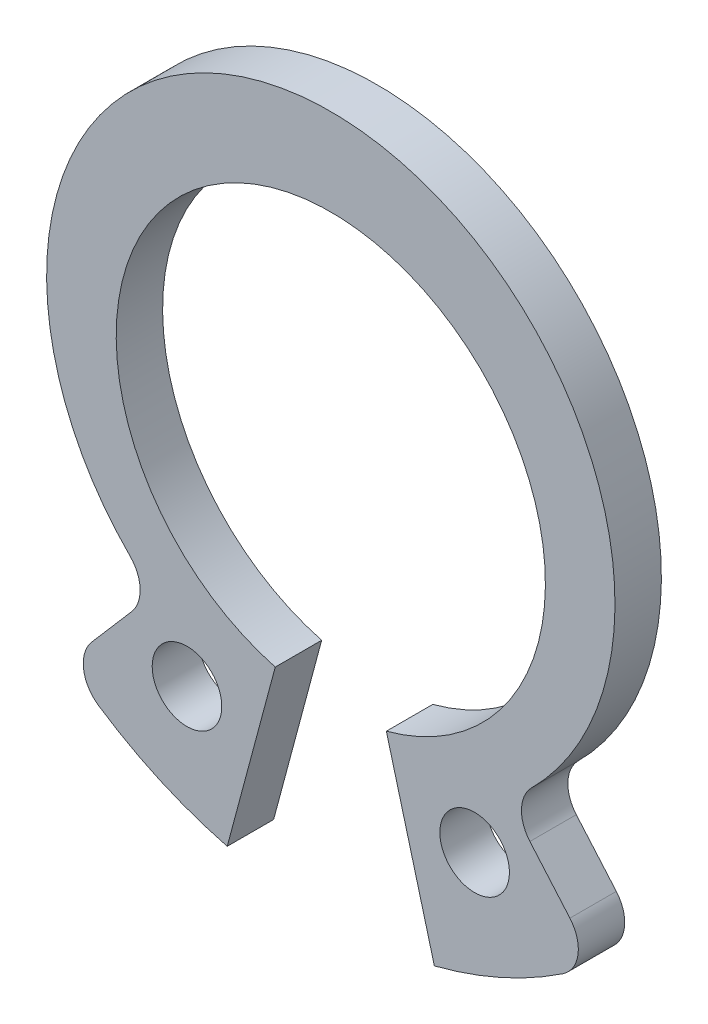
ISO-10303-21;
HEADER;
FILE_DESCRIPTION(('STEP AP214'),'2;1');
FILE_NAME('part.step','',(''),(''),'','','');
FILE_SCHEMA(('AUTOMOTIVE_DESIGN { 1 0 10303 214 1 1 1 1 }'));
ENDSEC;
DATA;
#1=APPLICATION_CONTEXT('core data for automotive mechanical design processes');
#2=APPLICATION_PROTOCOL_DEFINITION('international standard','automotive_design',2000,#1);
#3=PRODUCT_CONTEXT('',#1,'mechanical');
#4=PRODUCT('Part','Part','',(#3));
#5=PRODUCT_RELATED_PRODUCT_CATEGORY('part','',(#4));
#6=PRODUCT_DEFINITION_FORMATION('','',#4);
#7=PRODUCT_DEFINITION_CONTEXT('part definition',#1,'design');
#8=PRODUCT_DEFINITION('design','',#6,#7);
#9=PRODUCT_DEFINITION_SHAPE('','',#8);
#10=(LENGTH_UNIT() NAMED_UNIT(*) SI_UNIT(.MILLI.,.METRE.));
#11=(NAMED_UNIT(*) PLANE_ANGLE_UNIT() SI_UNIT($,.RADIAN.));
#12=(NAMED_UNIT(*) SI_UNIT($,.STERADIAN.) SOLID_ANGLE_UNIT());
#13=UNCERTAINTY_MEASURE_WITH_UNIT(LENGTH_MEASURE(1.E-05),#10,'distance_accuracy_value','');
#14=(GEOMETRIC_REPRESENTATION_CONTEXT(3) GLOBAL_UNCERTAINTY_ASSIGNED_CONTEXT((#13)) GLOBAL_UNIT_ASSIGNED_CONTEXT((#10,
#11,#12)) REPRESENTATION_CONTEXT('',''));
#15=CARTESIAN_POINT('',(0.,0.,0.));
#16=DIRECTION('',(0.,0.,1.));
#17=DIRECTION('',(1.,0.,0.));
#18=AXIS2_PLACEMENT_3D('',#15,#16,#17);
#19=CARTESIAN_POINT('',(-3.88705054500589,-3.59112298193843,0.8));
#20=DIRECTION('',(0.,0.,-1.));
#21=DIRECTION('',(-1.,0.,0.));
#22=AXIS2_PLACEMENT_3D('',#19,#20,#21);
#23=PLANE('',#22);
#24=CARTESIAN_POINT('',(2.4797895302576,-4.62373948499954,0.8));
#25=DIRECTION('',(0.,0.,1.));
#26=DIRECTION('',(1.,0.,0.));
#27=AXIS2_PLACEMENT_3D('',#24,#25,#26);
#28=CIRCLE('',#27,0.6);
#29=CARTESIAN_POINT('',(3.0797895302576,-4.62373948499954,0.8));
#30=VERTEX_POINT('',#29);
#31=EDGE_CURVE('E139',#30,#30,#28,.T.);
#32=ORIENTED_EDGE('',*,*,#31,.F.);
#33=EDGE_LOOP('',(#32));
#34=FACE_BOUND('',#33,.T.);
#35=CARTESIAN_POINT('',(-3.88705054500589,-3.59112298193843,0.8));
#36=DIRECTION('',(0.,0.,-1.));
#37=DIRECTION('',(-1.,0.,0.));
#38=AXIS2_PLACEMENT_3D('',#35,#36,#37);
#39=CIRCLE('',#38,0.600000000000001);
#40=CARTESIAN_POINT('',(-3.46300866736889,-3.16663683845423,0.8));
#41=VERTEX_POINT('',#40);
#42=CARTESIAN_POINT('',(-3.43255273753933,-3.98282662374954,0.8));
#43=VERTEX_POINT('',#42);
#44=EDGE_CURVE('E165',#41,#43,#39,.T.);
#45=ORIENTED_EDGE('',*,*,#44,.T.);
#46=DIRECTION('',(-0.652839403018525,-0.757496345777599,0.));
#47=VECTOR('',#46,1.);
#48=CARTESIAN_POINT('',(-3.43255273753933,-3.98282662374954,0.8));
#49=LINE('',#48,#47);
#50=CARTESIAN_POINT('',(-4.12249600229278,-4.78337496600359,0.8));
#51=VERTEX_POINT('',#50);
#52=EDGE_CURVE('E134',#43,#51,#49,.T.);
#53=ORIENTED_EDGE('',*,*,#52,.T.);
#54=CARTESIAN_POINT('',(-3.66799819482622,-5.1750786078147,0.8));
#55=DIRECTION('',(0.,0.,1.));
#56=DIRECTION('',(-1.,0.,0.));
#57=AXIS2_PLACEMENT_3D('',#54,#55,#56);
#58=CIRCLE('',#57,0.600000000000001);
#59=CARTESIAN_POINT('',(-4.00194859363588,-5.67355341272953,0.8));
#60=VERTEX_POINT('',#59);
#61=EDGE_CURVE('E168',#51,#60,#58,.T.);
#62=ORIENTED_EDGE('',*,*,#61,.T.);
#63=CARTESIAN_POINT('',(0.,0.3,0.8));
#64=DIRECTION('',(0.,0.,1.));
#65=DIRECTION('',(1.,0.,0.));
#66=AXIS2_PLACEMENT_3D('',#63,#64,#65);
#67=CIRCLE('',#66,7.19019700153179);
#68=CARTESIAN_POINT('',(-1.7858514112074,-6.66488820139457,0.8));
#69=VERTEX_POINT('',#68);
#70=EDGE_CURVE('E170',#60,#69,#67,.T.);
#71=ORIENTED_EDGE('',*,*,#70,.T.);
#72=DIRECTION('',(0.258819045102521,0.965925826289068,0.));
#73=VECTOR('',#72,1.);
#74=CARTESIAN_POINT('',(-0.957630466879329,-3.57392555726955,0.8));
#75=LINE('',#74,#73);
#76=CARTESIAN_POINT('',(-0.957630466879326,-3.57392555726955,0.8));
#77=VERTEX_POINT('',#76);
#78=EDGE_CURVE('E172',#69,#77,#75,.T.);
#79=ORIENTED_EDGE('',*,*,#78,.T.);
#80=CARTESIAN_POINT('',(0.,0.,0.8));
#81=DIRECTION('',(0.,0.,-1.));
#82=DIRECTION('',(1.,0.,0.));
#83=AXIS2_PLACEMENT_3D('',#80,#81,#82);
#84=CIRCLE('',#83,3.7);
#85=CARTESIAN_POINT('',(0.957630466879329,-3.57392555726955,0.8));
#86=VERTEX_POINT('',#85);
#87=EDGE_CURVE('E174',#77,#86,#84,.T.);
#88=ORIENTED_EDGE('',*,*,#87,.T.);
#89=DIRECTION('',(0.258819045102521,-0.965925826289068,0.));
#90=VECTOR('',#89,1.);
#91=CARTESIAN_POINT('',(0.957630466879329,-3.57392555726955,0.8));
#92=LINE('',#91,#90);
#93=CARTESIAN_POINT('',(1.7858514112074,-6.66488820139457,0.8));
#94=VERTEX_POINT('',#93);
#95=EDGE_CURVE('E176',#86,#94,#92,.T.);
#96=ORIENTED_EDGE('',*,*,#95,.T.);
#97=CARTESIAN_POINT('',(0.,0.3,0.8));
#98=DIRECTION('',(0.,0.,1.));
#99=DIRECTION('',(1.,0.,0.));
#100=AXIS2_PLACEMENT_3D('',#97,#98,#99);
#101=CIRCLE('',#100,7.19019700153179);
#102=CARTESIAN_POINT('',(4.00194859363587,-5.67355341272953,0.8));
#103=VERTEX_POINT('',#102);
#104=EDGE_CURVE('E178',#94,#103,#101,.T.);
#105=ORIENTED_EDGE('',*,*,#104,.T.);
#106=CARTESIAN_POINT('',(3.66799819482622,-5.1750786078147,0.8));
#107=DIRECTION('',(0.,0.,1.));
#108=DIRECTION('',(1.,0.,0.));
#109=AXIS2_PLACEMENT_3D('',#106,#107,#108);
#110=CIRCLE('',#109,0.600000000000001);
#111=CARTESIAN_POINT('',(4.12249600229278,-4.78337496600359,0.8));
#112=VERTEX_POINT('',#111);
#113=EDGE_CURVE('E180',#103,#112,#110,.T.);
#114=ORIENTED_EDGE('',*,*,#113,.T.);
#115=DIRECTION('',(-0.652839403018525,0.757496345777599,0.));
#116=VECTOR('',#115,1.);
#117=CARTESIAN_POINT('',(3.43255273753933,-3.98282662374954,0.8));
#118=LINE('',#117,#116);
#119=CARTESIAN_POINT('',(3.43255273753933,-3.98282662374954,0.8));
#120=VERTEX_POINT('',#119);
#121=EDGE_CURVE('E182',#112,#120,#118,.T.);
#122=ORIENTED_EDGE('',*,*,#121,.T.);
#123=CARTESIAN_POINT('',(3.88705054500589,-3.59112298193843,0.8));
#124=DIRECTION('',(0.,0.,-1.));
#125=DIRECTION('',(1.,0.,0.));
#126=AXIS2_PLACEMENT_3D('',#123,#124,#125);
#127=CIRCLE('',#126,0.600000000000001);
#128=CARTESIAN_POINT('',(3.46300866736888,-3.16663683845424,0.8));
#129=VERTEX_POINT('',#128);
#130=EDGE_CURVE('E51',#120,#129,#127,.T.);
#131=ORIENTED_EDGE('',*,*,#130,.T.);
#132=CARTESIAN_POINT('',(0.,0.3,0.8));
#133=DIRECTION('',(0.,0.,1.));
#134=DIRECTION('',(1.,0.,0.));
#135=AXIS2_PLACEMENT_3D('',#132,#133,#134);
#136=CIRCLE('',#135,4.9);
#137=EDGE_CURVE('E46',#129,#41,#136,.T.);
#138=ORIENTED_EDGE('',*,*,#137,.T.);
#139=EDGE_LOOP('',(#45,#53,#62,#71,#79,#88,#96,#105,#114,#122,#131,#138));
#140=FACE_BOUND('',#139,.T.);
#141=CARTESIAN_POINT('',(-2.4797895302576,-4.62373948499954,0.8));
#142=DIRECTION('',(0.,0.,1.));
#143=DIRECTION('',(-1.,0.,0.));
#144=AXIS2_PLACEMENT_3D('',#141,#142,#143);
#145=CIRCLE('',#144,0.6);
#146=CARTESIAN_POINT('',(-3.0797895302576,-4.62373948499954,0.8));
#147=VERTEX_POINT('',#146);
#148=EDGE_CURVE('E285',#147,#147,#145,.T.);
#149=ORIENTED_EDGE('',*,*,#148,.F.);
#150=EDGE_LOOP('',(#149));
#151=FACE_BOUND('',#150,.T.);
#152=ADVANCED_FACE('F31',(#34,#140,#151),#23,.F.);
#153=CARTESIAN_POINT('',(-3.88705054500589,-3.59112298193843,0.));
#154=DIRECTION('',(0.,0.,-1.));
#155=DIRECTION('',(-1.,0.,0.));
#156=AXIS2_PLACEMENT_3D('',#153,#154,#155);
#157=PLANE('',#156);
#158=CARTESIAN_POINT('',(2.4797895302576,-4.62373948499954,0.));
#159=DIRECTION('',(0.,0.,1.));
#160=DIRECTION('',(1.,0.,0.));
#161=AXIS2_PLACEMENT_3D('',#158,#159,#160);
#162=CIRCLE('',#161,0.6);
#163=CARTESIAN_POINT('',(3.0797895302576,-4.62373948499954,0.));
#164=VERTEX_POINT('',#163);
#165=EDGE_CURVE('E142',#164,#164,#162,.T.);
#166=ORIENTED_EDGE('',*,*,#165,.T.);
#167=EDGE_LOOP('',(#166));
#168=FACE_BOUND('',#167,.T.);
#169=CARTESIAN_POINT('',(-3.88705054500589,-3.59112298193843,0.));
#170=DIRECTION('',(0.,0.,-1.));
#171=DIRECTION('',(-1.,0.,0.));
#172=AXIS2_PLACEMENT_3D('',#169,#170,#171);
#173=CIRCLE('',#172,0.600000000000001);
#174=CARTESIAN_POINT('',(-3.46300866736889,-3.16663683845423,0.));
#175=VERTEX_POINT('',#174);
#176=CARTESIAN_POINT('',(-3.43255273753933,-3.98282662374954,0.));
#177=VERTEX_POINT('',#176);
#178=EDGE_CURVE('E125',#175,#177,#173,.T.);
#179=ORIENTED_EDGE('',*,*,#178,.F.);
#180=CARTESIAN_POINT('',(0.,0.3,0.));
#181=DIRECTION('',(0.,0.,1.));
#182=DIRECTION('',(1.,0.,0.));
#183=AXIS2_PLACEMENT_3D('',#180,#181,#182);
#184=CIRCLE('',#183,4.9);
#185=CARTESIAN_POINT('',(3.46300866736888,-3.16663683845424,0.));
#186=VERTEX_POINT('',#185);
#187=EDGE_CURVE('E163',#186,#175,#184,.T.);
#188=ORIENTED_EDGE('',*,*,#187,.F.);
#189=CARTESIAN_POINT('',(3.88705054500589,-3.59112298193843,0.));
#190=DIRECTION('',(0.,0.,-1.));
#191=DIRECTION('',(1.,0.,0.));
#192=AXIS2_PLACEMENT_3D('',#189,#190,#191);
#193=CIRCLE('',#192,0.600000000000001);
#194=CARTESIAN_POINT('',(3.43255273753933,-3.98282662374954,0.));
#195=VERTEX_POINT('',#194);
#196=EDGE_CURVE('E161',#195,#186,#193,.T.);
#197=ORIENTED_EDGE('',*,*,#196,.F.);
#198=DIRECTION('',(-0.652839403018525,0.757496345777599,0.));
#199=VECTOR('',#198,1.);
#200=CARTESIAN_POINT('',(3.43255273753933,-3.98282662374954,0.));
#201=LINE('',#200,#199);
#202=CARTESIAN_POINT('',(4.12249600229278,-4.78337496600359,0.));
#203=VERTEX_POINT('',#202);
#204=EDGE_CURVE('E159',#203,#195,#201,.T.);
#205=ORIENTED_EDGE('',*,*,#204,.F.);
#206=CARTESIAN_POINT('',(3.66799819482622,-5.1750786078147,0.));
#207=DIRECTION('',(0.,0.,1.));
#208=DIRECTION('',(1.,0.,0.));
#209=AXIS2_PLACEMENT_3D('',#206,#207,#208);
#210=CIRCLE('',#209,0.600000000000001);
#211=CARTESIAN_POINT('',(4.00194859363587,-5.67355341272953,0.));
#212=VERTEX_POINT('',#211);
#213=EDGE_CURVE('E157',#212,#203,#210,.T.);
#214=ORIENTED_EDGE('',*,*,#213,.F.);
#215=CARTESIAN_POINT('',(0.,0.3,0.));
#216=DIRECTION('',(0.,0.,1.));
#217=DIRECTION('',(1.,0.,0.));
#218=AXIS2_PLACEMENT_3D('',#215,#216,#217);
#219=CIRCLE('',#218,7.19019700153179);
#220=CARTESIAN_POINT('',(1.7858514112074,-6.66488820139457,0.));
#221=VERTEX_POINT('',#220);
#222=EDGE_CURVE('E155',#221,#212,#219,.T.);
#223=ORIENTED_EDGE('',*,*,#222,.F.);
#224=DIRECTION('',(0.258819045102521,-0.965925826289068,0.));
#225=VECTOR('',#224,1.);
#226=CARTESIAN_POINT('',(0.957630466879329,-3.57392555726955,0.));
#227=LINE('',#226,#225);
#228=CARTESIAN_POINT('',(0.957630466879329,-3.57392555726955,0.));
#229=VERTEX_POINT('',#228);
#230=EDGE_CURVE('E153',#229,#221,#227,.T.);
#231=ORIENTED_EDGE('',*,*,#230,.F.);
#232=CARTESIAN_POINT('',(0.,0.,0.));
#233=DIRECTION('',(0.,0.,-1.));
#234=DIRECTION('',(1.,0.,0.));
#235=AXIS2_PLACEMENT_3D('',#232,#233,#234);
#236=CIRCLE('',#235,3.7);
#237=CARTESIAN_POINT('',(-0.957630466879326,-3.57392555726955,0.));
#238=VERTEX_POINT('',#237);
#239=EDGE_CURVE('E151',#238,#229,#236,.T.);
#240=ORIENTED_EDGE('',*,*,#239,.F.);
#241=DIRECTION('',(0.258819045102521,0.965925826289068,0.));
#242=VECTOR('',#241,1.);
#243=CARTESIAN_POINT('',(-0.957630466879329,-3.57392555726955,0.));
#244=LINE('',#243,#242);
#245=CARTESIAN_POINT('',(-1.7858514112074,-6.66488820139457,0.));
#246=VERTEX_POINT('',#245);
#247=EDGE_CURVE('E149',#246,#238,#244,.T.);
#248=ORIENTED_EDGE('',*,*,#247,.F.);
#249=CARTESIAN_POINT('',(0.,0.3,0.));
#250=DIRECTION('',(0.,0.,1.));
#251=DIRECTION('',(1.,0.,0.));
#252=AXIS2_PLACEMENT_3D('',#249,#250,#251);
#253=CIRCLE('',#252,7.19019700153179);
#254=CARTESIAN_POINT('',(-4.00194859363588,-5.67355341272953,0.));
#255=VERTEX_POINT('',#254);
#256=EDGE_CURVE('E147',#255,#246,#253,.T.);
#257=ORIENTED_EDGE('',*,*,#256,.F.);
#258=CARTESIAN_POINT('',(-3.66799819482622,-5.1750786078147,0.));
#259=DIRECTION('',(0.,0.,1.));
#260=DIRECTION('',(-1.,0.,0.));
#261=AXIS2_PLACEMENT_3D('',#258,#259,#260);
#262=CIRCLE('',#261,0.600000000000001);
#263=CARTESIAN_POINT('',(-4.12249600229278,-4.78337496600359,0.));
#264=VERTEX_POINT('',#263);
#265=EDGE_CURVE('E127',#264,#255,#262,.T.);
#266=ORIENTED_EDGE('',*,*,#265,.F.);
#267=DIRECTION('',(-0.652839403018525,-0.757496345777599,0.));
#268=VECTOR('',#267,1.);
#269=CARTESIAN_POINT('',(-3.43255273753933,-3.98282662374954,0.));
#270=LINE('',#269,#268);
#271=EDGE_CURVE('E120',#177,#264,#270,.T.);
#272=ORIENTED_EDGE('',*,*,#271,.F.);
#273=EDGE_LOOP('',(#179,#188,#197,#205,#214,#223,#231,#240,#248,#257,#266,#272));
#274=FACE_BOUND('',#273,.T.);
#275=CARTESIAN_POINT('',(-2.4797895302576,-4.62373948499954,0.));
#276=DIRECTION('',(0.,0.,1.));
#277=DIRECTION('',(-1.,0.,0.));
#278=AXIS2_PLACEMENT_3D('',#275,#276,#277);
#279=CIRCLE('',#278,0.6);
#280=CARTESIAN_POINT('',(-3.0797895302576,-4.62373948499954,0.));
#281=VERTEX_POINT('',#280);
#282=EDGE_CURVE('E288',#281,#281,#279,.T.);
#283=ORIENTED_EDGE('',*,*,#282,.T.);
#284=EDGE_LOOP('',(#283));
#285=FACE_BOUND('',#284,.T.);
#286=ADVANCED_FACE('F121',(#168,#274,#285),#157,.T.);
#287=CARTESIAN_POINT('',(-3.88705054500589,-3.59112298193843,0.8));
#288=DIRECTION('',(0.,0.,-1.));
#289=DIRECTION('',(-1.,0.,0.));
#290=AXIS2_PLACEMENT_3D('',#287,#288,#289);
#291=CYLINDRICAL_SURFACE('',#290,0.600000000000001);
#292=ORIENTED_EDGE('',*,*,#178,.T.);
#293=DIRECTION('',(0.,0.,-1.));
#294=VECTOR('',#293,1.);
#295=CARTESIAN_POINT('',(-3.43255273753933,-3.98282662374954,0.8));
#296=LINE('',#295,#294);
#297=EDGE_CURVE('E11',#43,#177,#296,.T.);
#298=ORIENTED_EDGE('',*,*,#297,.F.);
#299=ORIENTED_EDGE('',*,*,#44,.F.);
#300=DIRECTION('',(0.,0.,-1.));
#301=VECTOR('',#300,1.);
#302=CARTESIAN_POINT('',(-3.46300866736889,-3.16663683845423,0.8));
#303=LINE('',#302,#301);
#304=EDGE_CURVE('E138',#41,#175,#303,.T.);
#305=ORIENTED_EDGE('',*,*,#304,.T.);
#306=EDGE_LOOP('',(#292,#298,#299,#305));
#307=FACE_BOUND('',#306,.T.);
#308=ADVANCED_FACE('F33',(#307),#291,.F.);
#309=CARTESIAN_POINT('',(-3.43255273753933,-3.98282662374954,0.8));
#310=DIRECTION('',(0.757496345777599,-0.652839403018525,0.));
#311=DIRECTION('',(0.652839403018525,0.757496345777599,0.));
#312=AXIS2_PLACEMENT_3D('',#309,#310,#311);
#313=PLANE('',#312);
#314=ORIENTED_EDGE('',*,*,#271,.T.);
#315=DIRECTION('',(0.,0.,-1.));
#316=VECTOR('',#315,1.);
#317=CARTESIAN_POINT('',(-4.12249600229278,-4.78337496600359,0.8));
#318=LINE('',#317,#316);
#319=EDGE_CURVE('E39',#51,#264,#318,.T.);
#320=ORIENTED_EDGE('',*,*,#319,.F.);
#321=ORIENTED_EDGE('',*,*,#52,.F.);
#322=ORIENTED_EDGE('',*,*,#297,.T.);
#323=EDGE_LOOP('',(#314,#320,#321,#322));
#324=FACE_BOUND('',#323,.T.);
#325=ADVANCED_FACE('F133',(#324),#313,.F.);
#326=CARTESIAN_POINT('',(-3.66799819482622,-5.1750786078147,0.8));
#327=DIRECTION('',(0.,0.,-1.));
#328=DIRECTION('',(-1.,0.,0.));
#329=AXIS2_PLACEMENT_3D('',#326,#327,#328);
#330=CYLINDRICAL_SURFACE('',#329,0.600000000000001);
#331=ORIENTED_EDGE('',*,*,#265,.T.);
#332=DIRECTION('',(0.,0.,-1.));
#333=VECTOR('',#332,1.);
#334=CARTESIAN_POINT('',(-4.00194859363588,-5.67355341272953,0.8));
#335=LINE('',#334,#333);
#336=EDGE_CURVE('E211',#60,#255,#335,.T.);
#337=ORIENTED_EDGE('',*,*,#336,.F.);
#338=ORIENTED_EDGE('',*,*,#61,.F.);
#339=ORIENTED_EDGE('',*,*,#319,.T.);
#340=EDGE_LOOP('',(#331,#337,#338,#339));
#341=FACE_BOUND('',#340,.T.);
#342=ADVANCED_FACE('F215',(#341),#330,.T.);
#343=CARTESIAN_POINT('',(0.,0.3,0.8));
#344=DIRECTION('',(0.,0.,-1.));
#345=DIRECTION('',(-1.,0.,0.));
#346=AXIS2_PLACEMENT_3D('',#343,#344,#345);
#347=CYLINDRICAL_SURFACE('',#346,7.19019700153179);
#348=ORIENTED_EDGE('',*,*,#256,.T.);
#349=DIRECTION('',(0.,0.,-1.));
#350=VECTOR('',#349,1.);
#351=CARTESIAN_POINT('',(-1.7858514112074,-6.66488820139457,0.8));
#352=LINE('',#351,#350);
#353=EDGE_CURVE('E208',#69,#246,#352,.T.);
#354=ORIENTED_EDGE('',*,*,#353,.F.);
#355=ORIENTED_EDGE('',*,*,#70,.F.);
#356=ORIENTED_EDGE('',*,*,#336,.T.);
#357=EDGE_LOOP('',(#348,#354,#355,#356));
#358=FACE_BOUND('',#357,.T.);
#359=ADVANCED_FACE('F223',(#358),#347,.T.);
#360=CARTESIAN_POINT('',(-0.957630466879329,-3.57392555726955,0.8));
#361=DIRECTION('',(-0.965925826289068,0.258819045102521,0.));
#362=DIRECTION('',(-0.258819045102521,-0.965925826289068,0.));
#363=AXIS2_PLACEMENT_3D('',#360,#361,#362);
#364=PLANE('',#363);
#365=ORIENTED_EDGE('',*,*,#247,.T.);
#366=DIRECTION('',(0.,0.,-1.));
#367=VECTOR('',#366,1.);
#368=CARTESIAN_POINT('',(-0.957630466879326,-3.57392555726955,0.8));
#369=LINE('',#368,#367);
#370=EDGE_CURVE('E205',#77,#238,#369,.T.);
#371=ORIENTED_EDGE('',*,*,#370,.F.);
#372=ORIENTED_EDGE('',*,*,#78,.F.);
#373=ORIENTED_EDGE('',*,*,#353,.T.);
#374=EDGE_LOOP('',(#365,#371,#372,#373));
#375=FACE_BOUND('',#374,.T.);
#376=ADVANCED_FACE('F226',(#375),#364,.F.);
#377=CARTESIAN_POINT('',(0.,0.,0.8));
#378=DIRECTION('',(0.,0.,-1.));
#379=DIRECTION('',(-1.,0.,0.));
#380=AXIS2_PLACEMENT_3D('',#377,#378,#379);
#381=CYLINDRICAL_SURFACE('',#380,3.7);
#382=ORIENTED_EDGE('',*,*,#239,.T.);
#383=DIRECTION('',(0.,0.,-1.));
#384=VECTOR('',#383,1.);
#385=CARTESIAN_POINT('',(0.957630466879329,-3.57392555726955,0.8));
#386=LINE('',#385,#384);
#387=EDGE_CURVE('E202',#86,#229,#386,.T.);
#388=ORIENTED_EDGE('',*,*,#387,.F.);
#389=ORIENTED_EDGE('',*,*,#87,.F.);
#390=ORIENTED_EDGE('',*,*,#370,.T.);
#391=EDGE_LOOP('',(#382,#388,#389,#390));
#392=FACE_BOUND('',#391,.T.);
#393=ADVANCED_FACE('F231',(#392),#381,.F.);
#394=CARTESIAN_POINT('',(0.957630466879329,-3.57392555726955,0.8));
#395=DIRECTION('',(0.965925826289068,0.258819045102521,0.));
#396=DIRECTION('',(-0.258819045102521,0.965925826289068,0.));
#397=AXIS2_PLACEMENT_3D('',#394,#395,#396);
#398=PLANE('',#397);
#399=ORIENTED_EDGE('',*,*,#230,.T.);
#400=DIRECTION('',(0.,0.,-1.));
#401=VECTOR('',#400,1.);
#402=CARTESIAN_POINT('',(1.7858514112074,-6.66488820139457,0.8));
#403=LINE('',#402,#401);
#404=EDGE_CURVE('E199',#94,#221,#403,.T.);
#405=ORIENTED_EDGE('',*,*,#404,.F.);
#406=ORIENTED_EDGE('',*,*,#95,.F.);
#407=ORIENTED_EDGE('',*,*,#387,.T.);
#408=EDGE_LOOP('',(#399,#405,#406,#407));
#409=FACE_BOUND('',#408,.T.);
#410=ADVANCED_FACE('F237',(#409),#398,.F.);
#411=CARTESIAN_POINT('',(0.,0.3,0.8));
#412=DIRECTION('',(0.,0.,-1.));
#413=DIRECTION('',(-1.,0.,0.));
#414=AXIS2_PLACEMENT_3D('',#411,#412,#413);
#415=CYLINDRICAL_SURFACE('',#414,7.19019700153179);
#416=ORIENTED_EDGE('',*,*,#222,.T.);
#417=DIRECTION('',(0.,0.,-1.));
#418=VECTOR('',#417,1.);
#419=CARTESIAN_POINT('',(4.00194859363587,-5.67355341272953,0.8));
#420=LINE('',#419,#418);
#421=EDGE_CURVE('E196',#103,#212,#420,.T.);
#422=ORIENTED_EDGE('',*,*,#421,.F.);
#423=ORIENTED_EDGE('',*,*,#104,.F.);
#424=ORIENTED_EDGE('',*,*,#404,.T.);
#425=EDGE_LOOP('',(#416,#422,#423,#424));
#426=FACE_BOUND('',#425,.T.);
#427=ADVANCED_FACE('F241',(#426),#415,.T.);
#428=CARTESIAN_POINT('',(3.66799819482622,-5.1750786078147,0.8));
#429=DIRECTION('',(0.,0.,-1.));
#430=DIRECTION('',(-1.,0.,0.));
#431=AXIS2_PLACEMENT_3D('',#428,#429,#430);
#432=CYLINDRICAL_SURFACE('',#431,0.600000000000001);
#433=ORIENTED_EDGE('',*,*,#213,.T.);
#434=DIRECTION('',(0.,0.,-1.));
#435=VECTOR('',#434,1.);
#436=CARTESIAN_POINT('',(4.12249600229278,-4.78337496600359,0.8));
#437=LINE('',#436,#435);
#438=EDGE_CURVE('E193',#112,#203,#437,.T.);
#439=ORIENTED_EDGE('',*,*,#438,.F.);
#440=ORIENTED_EDGE('',*,*,#113,.F.);
#441=ORIENTED_EDGE('',*,*,#421,.T.);
#442=EDGE_LOOP('',(#433,#439,#440,#441));
#443=FACE_BOUND('',#442,.T.);
#444=ADVANCED_FACE('F246',(#443),#432,.T.);
#445=CARTESIAN_POINT('',(3.43255273753933,-3.98282662374954,0.8));
#446=DIRECTION('',(-0.757496345777599,-0.652839403018525,0.));
#447=DIRECTION('',(0.652839403018525,-0.757496345777599,0.));
#448=AXIS2_PLACEMENT_3D('',#445,#446,#447);
#449=PLANE('',#448);
#450=ORIENTED_EDGE('',*,*,#204,.T.);
#451=DIRECTION('',(0.,0.,-1.));
#452=VECTOR('',#451,1.);
#453=CARTESIAN_POINT('',(3.43255273753933,-3.98282662374954,0.8));
#454=LINE('',#453,#452);
#455=EDGE_CURVE('E190',#120,#195,#454,.T.);
#456=ORIENTED_EDGE('',*,*,#455,.F.);
#457=ORIENTED_EDGE('',*,*,#121,.F.);
#458=ORIENTED_EDGE('',*,*,#438,.T.);
#459=EDGE_LOOP('',(#450,#456,#457,#458));
#460=FACE_BOUND('',#459,.T.);
#461=ADVANCED_FACE('F250',(#460),#449,.F.);
#462=CARTESIAN_POINT('',(3.88705054500589,-3.59112298193843,0.8));
#463=DIRECTION('',(0.,0.,-1.));
#464=DIRECTION('',(-1.,0.,0.));
#465=AXIS2_PLACEMENT_3D('',#462,#463,#464);
#466=CYLINDRICAL_SURFACE('',#465,0.600000000000001);
#467=ORIENTED_EDGE('',*,*,#196,.T.);
#468=DIRECTION('',(0.,0.,-1.));
#469=VECTOR('',#468,1.);
#470=CARTESIAN_POINT('',(3.46300866736888,-3.16663683845424,0.8));
#471=LINE('',#470,#469);
#472=EDGE_CURVE('E187',#129,#186,#471,.T.);
#473=ORIENTED_EDGE('',*,*,#472,.F.);
#474=ORIENTED_EDGE('',*,*,#130,.F.);
#475=ORIENTED_EDGE('',*,*,#455,.T.);
#476=EDGE_LOOP('',(#467,#473,#474,#475));
#477=FACE_BOUND('',#476,.T.);
#478=ADVANCED_FACE('F254',(#477),#466,.F.);
#479=CARTESIAN_POINT('',(0.,0.3,0.8));
#480=DIRECTION('',(0.,0.,-1.));
#481=DIRECTION('',(-1.,0.,0.));
#482=AXIS2_PLACEMENT_3D('',#479,#480,#481);
#483=CYLINDRICAL_SURFACE('',#482,4.9);
#484=ORIENTED_EDGE('',*,*,#187,.T.);
#485=ORIENTED_EDGE('',*,*,#304,.F.);
#486=ORIENTED_EDGE('',*,*,#137,.F.);
#487=ORIENTED_EDGE('',*,*,#472,.T.);
#488=EDGE_LOOP('',(#484,#485,#486,#487));
#489=FACE_BOUND('',#488,.T.);
#490=ADVANCED_FACE('F256',(#489),#483,.T.);
#491=CARTESIAN_POINT('',(2.4797895302576,-4.62373948499954,0.8));
#492=DIRECTION('',(0.,0.,-1.));
#493=DIRECTION('',(-1.,0.,0.));
#494=AXIS2_PLACEMENT_3D('',#491,#492,#493);
#495=CYLINDRICAL_SURFACE('',#494,0.6);
#496=ORIENTED_EDGE('',*,*,#31,.T.);
#497=EDGE_LOOP('',(#496));
#498=FACE_BOUND('',#497,.T.);
#499=ORIENTED_EDGE('',*,*,#165,.F.);
#500=EDGE_LOOP('',(#499));
#501=FACE_BOUND('',#500,.T.);
#502=ADVANCED_FACE('F258',(#498,#501),#495,.F.);
#503=CARTESIAN_POINT('',(-2.4797895302576,-4.62373948499954,0.8));
#504=DIRECTION('',(0.,0.,-1.));
#505=DIRECTION('',(-1.,0.,0.));
#506=AXIS2_PLACEMENT_3D('',#503,#504,#505);
#507=CYLINDRICAL_SURFACE('',#506,0.6);
#508=ORIENTED_EDGE('',*,*,#148,.T.);
#509=EDGE_LOOP('',(#508));
#510=FACE_BOUND('',#509,.T.);
#511=ORIENTED_EDGE('',*,*,#282,.F.);
#512=EDGE_LOOP('',(#511));
#513=FACE_BOUND('',#512,.T.);
#514=ADVANCED_FACE('F264',(#510,#513),#507,.F.);
#515=CLOSED_SHELL('',(#152,#286,#308,#325,#342,#359,#376,#393,#410,#427,#444,#461,#478,#490,
#502,#514));
#516=MANIFOLD_SOLID_BREP('B2',#515);
#517=ADVANCED_BREP_SHAPE_REPRESENTATION('',(#18,#516),#14);
#518=SHAPE_DEFINITION_REPRESENTATION(#9,#517);
ENDSEC;
END-ISO-10303-21;
